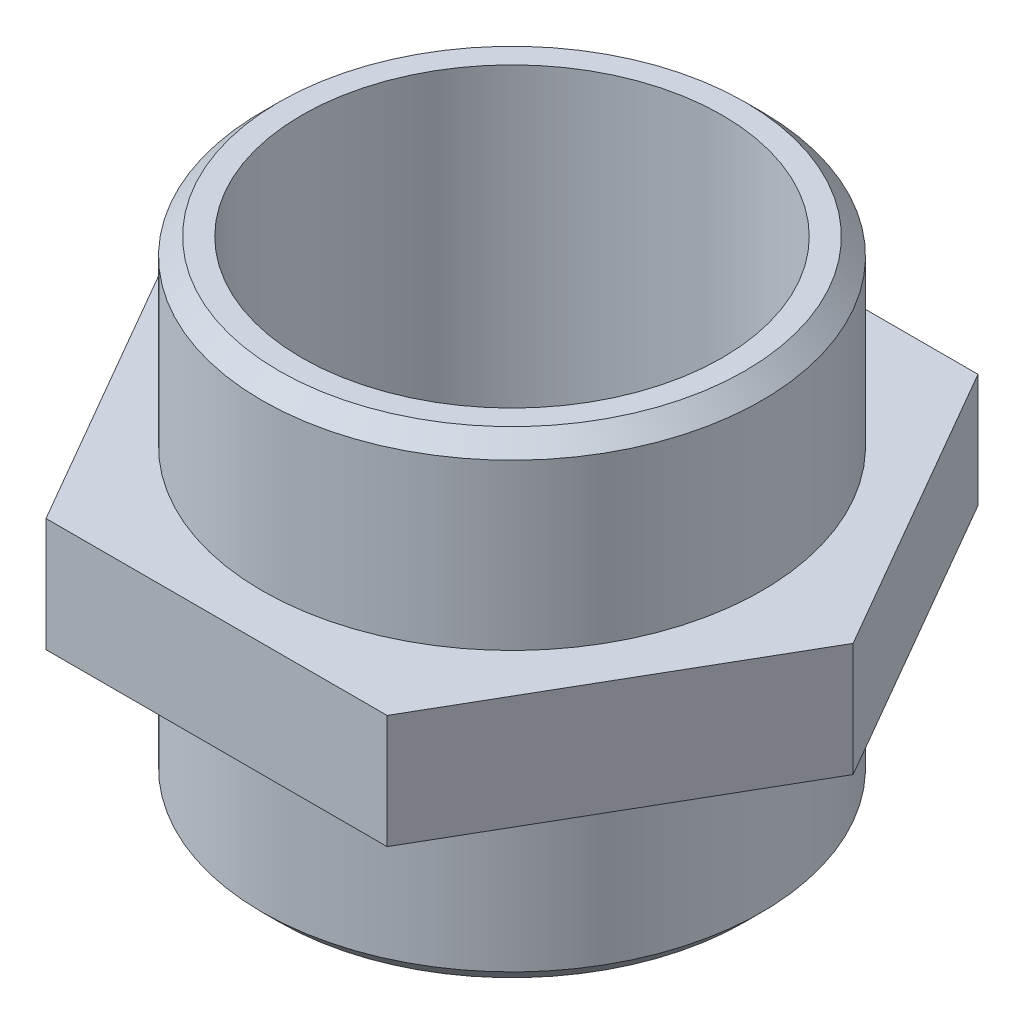
ISO-10303-21;
HEADER;
FILE_DESCRIPTION(('STEP AP214'),'2;1');
FILE_NAME('part.step','',(''),(''),'','','');
FILE_SCHEMA(('AUTOMOTIVE_DESIGN { 1 0 10303 214 1 1 1 1 }'));
ENDSEC;
DATA;
#1=APPLICATION_CONTEXT('core data for automotive mechanical design processes');
#2=APPLICATION_PROTOCOL_DEFINITION('international standard','automotive_design',2000,#1);
#3=PRODUCT_CONTEXT('',#1,'mechanical');
#4=PRODUCT('Part','Part','',(#3));
#5=PRODUCT_RELATED_PRODUCT_CATEGORY('part','',(#4));
#6=PRODUCT_DEFINITION_FORMATION('','',#4);
#7=PRODUCT_DEFINITION_CONTEXT('part definition',#1,'design');
#8=PRODUCT_DEFINITION('design','',#6,#7);
#9=PRODUCT_DEFINITION_SHAPE('','',#8);
#10=(LENGTH_UNIT() NAMED_UNIT(*) SI_UNIT(.MILLI.,.METRE.));
#11=(NAMED_UNIT(*) PLANE_ANGLE_UNIT() SI_UNIT($,.RADIAN.));
#12=(NAMED_UNIT(*) SI_UNIT($,.STERADIAN.) SOLID_ANGLE_UNIT());
#13=UNCERTAINTY_MEASURE_WITH_UNIT(LENGTH_MEASURE(1.E-05),#10,'distance_accuracy_value','');
#14=(GEOMETRIC_REPRESENTATION_CONTEXT(3) GLOBAL_UNCERTAINTY_ASSIGNED_CONTEXT((#13)) GLOBAL_UNIT_ASSIGNED_CONTEXT((#10,
#11,#12)) REPRESENTATION_CONTEXT('',''));
#15=CARTESIAN_POINT('',(0.,0.,0.));
#16=DIRECTION('',(0.,0.,1.));
#17=DIRECTION('',(1.,0.,0.));
#18=AXIS2_PLACEMENT_3D('',#15,#16,#17);
#19=CARTESIAN_POINT('',(0.,5.,0.));
#20=DIRECTION('',(0.,1.,0.));
#21=DIRECTION('',(0.,0.,1.));
#22=AXIS2_PLACEMENT_3D('',#19,#20,#21);
#23=PLANE('',#22);
#24=DIRECTION('',(1.,0.,0.));
#25=VECTOR('',#24,1.);
#26=CARTESIAN_POINT('',(-15.0111069989303,5.,26.));
#27=LINE('',#26,#25);
#28=CARTESIAN_POINT('',(-15.0111069989303,5.,26.));
#29=VERTEX_POINT('',#28);
#30=CARTESIAN_POINT('',(15.0111069989303,5.,26.));
#31=VERTEX_POINT('',#30);
#32=EDGE_CURVE('E129',#29,#31,#27,.T.);
#33=ORIENTED_EDGE('',*,*,#32,.T.);
#34=DIRECTION('',(0.5,0.,-0.866025403784439));
#35=VECTOR('',#34,1.);
#36=CARTESIAN_POINT('',(15.0111069989303,5.,26.));
#37=LINE('',#36,#35);
#38=CARTESIAN_POINT('',(30.0222139978605,5.,0.));
#39=VERTEX_POINT('',#38);
#40=EDGE_CURVE('E87',#31,#39,#37,.T.);
#41=ORIENTED_EDGE('',*,*,#40,.T.);
#42=DIRECTION('',(-0.5,0.,-0.866025403784439));
#43=VECTOR('',#42,1.);
#44=CARTESIAN_POINT('',(30.0222139978605,5.,0.));
#45=LINE('',#44,#43);
#46=CARTESIAN_POINT('',(15.0111069989303,5.,-26.));
#47=VERTEX_POINT('',#46);
#48=EDGE_CURVE('E100',#39,#47,#45,.T.);
#49=ORIENTED_EDGE('',*,*,#48,.T.);
#50=DIRECTION('',(-1.,0.,0.));
#51=VECTOR('',#50,1.);
#52=CARTESIAN_POINT('',(15.0111069989303,5.,-26.));
#53=LINE('',#52,#51);
#54=CARTESIAN_POINT('',(-15.0111069989303,5.,-26.));
#55=VERTEX_POINT('',#54);
#56=EDGE_CURVE('E94',#47,#55,#53,.T.);
#57=ORIENTED_EDGE('',*,*,#56,.T.);
#58=DIRECTION('',(-0.5,0.,0.866025403784439));
#59=VECTOR('',#58,1.);
#60=CARTESIAN_POINT('',(-15.0111069989303,5.,-26.));
#61=LINE('',#60,#59);
#62=CARTESIAN_POINT('',(-30.0222139978605,5.,0.));
#63=VERTEX_POINT('',#62);
#64=EDGE_CURVE('E98',#55,#63,#61,.T.);
#65=ORIENTED_EDGE('',*,*,#64,.T.);
#66=DIRECTION('',(0.5,0.,0.866025403784439));
#67=VECTOR('',#66,1.);
#68=CARTESIAN_POINT('',(-30.0222139978605,5.,0.));
#69=LINE('',#68,#67);
#70=EDGE_CURVE('E49',#63,#29,#69,.T.);
#71=ORIENTED_EDGE('',*,*,#70,.T.);
#72=EDGE_LOOP('',(#33,#41,#49,#57,#65,#71));
#73=FACE_BOUND('',#72,.T.);
#74=CARTESIAN_POINT('',(0.,5.,0.));
#75=DIRECTION('',(0.,1.,0.));
#76=DIRECTION('',(0.,0.,1.));
#77=AXIS2_PLACEMENT_3D('',#74,#75,#76);
#78=CIRCLE('',#77,22.);
#79=CARTESIAN_POINT('',(0.,5.,-22.));
#80=VERTEX_POINT('',#79);
#81=EDGE_CURVE('E122',#80,#80,#78,.F.);
#82=ORIENTED_EDGE('',*,*,#81,.T.);
#83=EDGE_LOOP('',(#82));
#84=FACE_BOUND('',#83,.T.);
#85=ADVANCED_FACE('F32',(#73,#84),#23,.T.);
#86=CARTESIAN_POINT('',(0.,-5.,0.));
#87=DIRECTION('',(0.,1.,0.));
#88=DIRECTION('',(0.,0.,1.));
#89=AXIS2_PLACEMENT_3D('',#86,#87,#88);
#90=PLANE('',#89);
#91=DIRECTION('',(1.,0.,0.));
#92=VECTOR('',#91,1.);
#93=CARTESIAN_POINT('',(-15.0111069989303,-5.,26.));
#94=LINE('',#93,#92);
#95=CARTESIAN_POINT('',(-15.0111069989303,-5.,26.));
#96=VERTEX_POINT('',#95);
#97=CARTESIAN_POINT('',(15.0111069989303,-5.,26.));
#98=VERTEX_POINT('',#97);
#99=EDGE_CURVE('E118',#96,#98,#94,.T.);
#100=ORIENTED_EDGE('',*,*,#99,.F.);
#101=DIRECTION('',(0.5,0.,0.866025403784439));
#102=VECTOR('',#101,1.);
#103=CARTESIAN_POINT('',(-30.0222139978605,-5.,0.));
#104=LINE('',#103,#102);
#105=CARTESIAN_POINT('',(-30.0222139978605,-5.,0.));
#106=VERTEX_POINT('',#105);
#107=EDGE_CURVE('E78',#106,#96,#104,.T.);
#108=ORIENTED_EDGE('',*,*,#107,.F.);
#109=DIRECTION('',(-0.5,0.,0.866025403784439));
#110=VECTOR('',#109,1.);
#111=CARTESIAN_POINT('',(-15.0111069989303,-5.,-26.));
#112=LINE('',#111,#110);
#113=CARTESIAN_POINT('',(-15.0111069989303,-5.,-26.));
#114=VERTEX_POINT('',#113);
#115=EDGE_CURVE('E72',#114,#106,#112,.T.);
#116=ORIENTED_EDGE('',*,*,#115,.F.);
#117=DIRECTION('',(-1.,0.,0.));
#118=VECTOR('',#117,1.);
#119=CARTESIAN_POINT('',(15.0111069989303,-5.,-26.));
#120=LINE('',#119,#118);
#121=CARTESIAN_POINT('',(15.0111069989303,-5.,-26.));
#122=VERTEX_POINT('',#121);
#123=EDGE_CURVE('E108',#122,#114,#120,.T.);
#124=ORIENTED_EDGE('',*,*,#123,.F.);
#125=DIRECTION('',(-0.5,0.,-0.866025403784439));
#126=VECTOR('',#125,1.);
#127=CARTESIAN_POINT('',(30.0222139978605,-5.,0.));
#128=LINE('',#127,#126);
#129=CARTESIAN_POINT('',(30.0222139978605,-5.,0.));
#130=VERTEX_POINT('',#129);
#131=EDGE_CURVE('E124',#130,#122,#128,.T.);
#132=ORIENTED_EDGE('',*,*,#131,.F.);
#133=DIRECTION('',(0.5,0.,-0.866025403784439));
#134=VECTOR('',#133,1.);
#135=CARTESIAN_POINT('',(15.0111069989303,-5.,26.));
#136=LINE('',#135,#134);
#137=EDGE_CURVE('E121',#98,#130,#136,.T.);
#138=ORIENTED_EDGE('',*,*,#137,.F.);
#139=EDGE_LOOP('',(#100,#108,#116,#124,#132,#138));
#140=FACE_BOUND('',#139,.T.);
#141=CARTESIAN_POINT('',(0.,-5.,0.));
#142=DIRECTION('',(0.,1.,0.));
#143=DIRECTION('',(0.,0.,1.));
#144=AXIS2_PLACEMENT_3D('',#141,#142,#143);
#145=CIRCLE('',#144,22.);
#146=CARTESIAN_POINT('',(0.,-5.,-22.));
#147=VERTEX_POINT('',#146);
#148=EDGE_CURVE('E138',#147,#147,#145,.F.);
#149=ORIENTED_EDGE('',*,*,#148,.F.);
#150=EDGE_LOOP('',(#149));
#151=FACE_BOUND('',#150,.T.);
#152=ADVANCED_FACE('F162',(#140,#151),#90,.F.);
#153=CARTESIAN_POINT('',(-15.0111069989303,5.,26.));
#154=DIRECTION('',(0.,0.,-1.));
#155=DIRECTION('',(-1.,0.,0.));
#156=AXIS2_PLACEMENT_3D('',#153,#154,#155);
#157=PLANE('',#156);
#158=ORIENTED_EDGE('',*,*,#99,.T.);
#159=DIRECTION('',(0.,-1.,0.));
#160=VECTOR('',#159,1.);
#161=CARTESIAN_POINT('',(15.0111069989303,5.,26.));
#162=LINE('',#161,#160);
#163=EDGE_CURVE('E136',#31,#98,#162,.T.);
#164=ORIENTED_EDGE('',*,*,#163,.F.);
#165=ORIENTED_EDGE('',*,*,#32,.F.);
#166=DIRECTION('',(0.,-1.,0.));
#167=VECTOR('',#166,1.);
#168=CARTESIAN_POINT('',(-15.0111069989303,5.,26.));
#169=LINE('',#168,#167);
#170=EDGE_CURVE('E114',#29,#96,#169,.T.);
#171=ORIENTED_EDGE('',*,*,#170,.T.);
#172=EDGE_LOOP('',(#158,#164,#165,#171));
#173=FACE_BOUND('',#172,.T.);
#174=ADVANCED_FACE('F167',(#173),#157,.F.);
#175=CARTESIAN_POINT('',(15.0111069989303,5.,26.));
#176=DIRECTION('',(-0.866025403784439,0.,-0.5));
#177=DIRECTION('',(-0.5,0.,0.866025403784439));
#178=AXIS2_PLACEMENT_3D('',#175,#176,#177);
#179=PLANE('',#178);
#180=ORIENTED_EDGE('',*,*,#137,.T.);
#181=DIRECTION('',(0.,-1.,0.));
#182=VECTOR('',#181,1.);
#183=CARTESIAN_POINT('',(30.0222139978605,5.,0.));
#184=LINE('',#183,#182);
#185=EDGE_CURVE('E133',#39,#130,#184,.T.);
#186=ORIENTED_EDGE('',*,*,#185,.F.);
#187=ORIENTED_EDGE('',*,*,#40,.F.);
#188=ORIENTED_EDGE('',*,*,#163,.T.);
#189=EDGE_LOOP('',(#180,#186,#187,#188));
#190=FACE_BOUND('',#189,.T.);
#191=ADVANCED_FACE('F185',(#190),#179,.F.);
#192=CARTESIAN_POINT('',(30.0222139978605,5.,0.));
#193=DIRECTION('',(-0.866025403784439,0.,0.5));
#194=DIRECTION('',(0.5,0.,0.866025403784439));
#195=AXIS2_PLACEMENT_3D('',#192,#193,#194);
#196=PLANE('',#195);
#197=ORIENTED_EDGE('',*,*,#131,.T.);
#198=DIRECTION('',(0.,-1.,0.));
#199=VECTOR('',#198,1.);
#200=CARTESIAN_POINT('',(15.0111069989303,5.,-26.));
#201=LINE('',#200,#199);
#202=EDGE_CURVE('E109',#47,#122,#201,.T.);
#203=ORIENTED_EDGE('',*,*,#202,.F.);
#204=ORIENTED_EDGE('',*,*,#48,.F.);
#205=ORIENTED_EDGE('',*,*,#185,.T.);
#206=EDGE_LOOP('',(#197,#203,#204,#205));
#207=FACE_BOUND('',#206,.T.);
#208=ADVANCED_FACE('F182',(#207),#196,.F.);
#209=CARTESIAN_POINT('',(15.0111069989303,5.,-26.));
#210=DIRECTION('',(0.,0.,1.));
#211=DIRECTION('',(1.,0.,0.));
#212=AXIS2_PLACEMENT_3D('',#209,#210,#211);
#213=PLANE('',#212);
#214=ORIENTED_EDGE('',*,*,#123,.T.);
#215=DIRECTION('',(0.,-1.,0.));
#216=VECTOR('',#215,1.);
#217=CARTESIAN_POINT('',(-15.0111069989303,5.,-26.));
#218=LINE('',#217,#216);
#219=EDGE_CURVE('E105',#55,#114,#218,.T.);
#220=ORIENTED_EDGE('',*,*,#219,.F.);
#221=ORIENTED_EDGE('',*,*,#56,.F.);
#222=ORIENTED_EDGE('',*,*,#202,.T.);
#223=EDGE_LOOP('',(#214,#220,#221,#222));
#224=FACE_BOUND('',#223,.T.);
#225=ADVANCED_FACE('F106',(#224),#213,.F.);
#226=CARTESIAN_POINT('',(-15.0111069989303,5.,-26.));
#227=DIRECTION('',(0.866025403784439,0.,0.5));
#228=DIRECTION('',(0.5,0.,-0.866025403784439));
#229=AXIS2_PLACEMENT_3D('',#226,#227,#228);
#230=PLANE('',#229);
#231=ORIENTED_EDGE('',*,*,#115,.T.);
#232=DIRECTION('',(0.,-1.,0.));
#233=VECTOR('',#232,1.);
#234=CARTESIAN_POINT('',(-30.0222139978605,5.,0.));
#235=LINE('',#234,#233);
#236=EDGE_CURVE('E110',#63,#106,#235,.T.);
#237=ORIENTED_EDGE('',*,*,#236,.F.);
#238=ORIENTED_EDGE('',*,*,#64,.F.);
#239=ORIENTED_EDGE('',*,*,#219,.T.);
#240=EDGE_LOOP('',(#231,#237,#238,#239));
#241=FACE_BOUND('',#240,.T.);
#242=ADVANCED_FACE('F112',(#241),#230,.F.);
#243=CARTESIAN_POINT('',(-30.0222139978605,5.,0.));
#244=DIRECTION('',(0.866025403784439,0.,-0.5));
#245=DIRECTION('',(-0.5,0.,-0.866025403784439));
#246=AXIS2_PLACEMENT_3D('',#243,#244,#245);
#247=PLANE('',#246);
#248=ORIENTED_EDGE('',*,*,#107,.T.);
#249=ORIENTED_EDGE('',*,*,#170,.F.);
#250=ORIENTED_EDGE('',*,*,#70,.F.);
#251=ORIENTED_EDGE('',*,*,#236,.T.);
#252=EDGE_LOOP('',(#248,#249,#250,#251));
#253=FACE_BOUND('',#252,.T.);
#254=ADVANCED_FACE('F174',(#253),#247,.F.);
#255=CARTESIAN_POINT('',(0.,21.,0.));
#256=DIRECTION('',(0.,-1.,0.));
#257=DIRECTION('',(0.,0.,-1.));
#258=AXIS2_PLACEMENT_3D('',#255,#256,#257);
#259=CYLINDRICAL_SURFACE('',#258,22.);
#260=CARTESIAN_POINT('',(0.,-19.5,0.));
#261=DIRECTION('',(0.,1.,0.));
#262=DIRECTION('',(0.,0.,1.));
#263=AXIS2_PLACEMENT_3D('',#260,#261,#262);
#264=CIRCLE('',#263,22.);
#265=CARTESIAN_POINT('',(0.,-19.5,-22.));
#266=VERTEX_POINT('',#265);
#267=EDGE_CURVE('E141',#266,#266,#264,.T.);
#268=CARTESIAN_POINT('',(0.,-19.5,-22.));
#269=CARTESIAN_POINT('',(0.,-19.3489583333333,-22.));
#270=CARTESIAN_POINT('',(0.,-19.1979166666666,-22.));
#271=CARTESIAN_POINT('',(0.,-18.8958333333333,-22.));
#272=CARTESIAN_POINT('',(0.,-18.7447916666666,-22.));
#273=CARTESIAN_POINT('',(0.,-18.4427083333333,-22.));
#274=CARTESIAN_POINT('',(0.,-18.2916666666666,-22.));
#275=CARTESIAN_POINT('',(0.,-17.9895833333333,-22.));
#276=CARTESIAN_POINT('',(0.,-17.8385416666666,-22.));
#277=CARTESIAN_POINT('',(0.,-17.5364583333333,-22.));
#278=CARTESIAN_POINT('',(0.,-17.3854166666666,-22.));
#279=CARTESIAN_POINT('',(0.,-17.0833333333333,-22.));
#280=CARTESIAN_POINT('',(0.,-16.9322916666666,-22.));
#281=CARTESIAN_POINT('',(0.,-16.6302083333333,-22.));
#282=CARTESIAN_POINT('',(0.,-16.4791666666666,-22.));
#283=CARTESIAN_POINT('',(0.,-16.1770833333333,-22.));
#284=CARTESIAN_POINT('',(0.,-16.0260416666666,-22.));
#285=CARTESIAN_POINT('',(0.,-15.7239583333333,-22.));
#286=CARTESIAN_POINT('',(0.,-15.5729166666666,-22.));
#287=CARTESIAN_POINT('',(0.,-15.2708333333333,-22.));
#288=CARTESIAN_POINT('',(0.,-15.1197916666666,-22.));
#289=CARTESIAN_POINT('',(0.,-14.8177083333333,-22.));
#290=CARTESIAN_POINT('',(0.,-14.6666666666666,-22.));
#291=CARTESIAN_POINT('',(0.,-14.3645833333333,-22.));
#292=CARTESIAN_POINT('',(0.,-14.2135416666666,-22.));
#293=CARTESIAN_POINT('',(0.,-13.9114583333333,-22.));
#294=CARTESIAN_POINT('',(0.,-13.7604166666666,-22.));
#295=CARTESIAN_POINT('',(0.,-13.4583333333333,-22.));
#296=CARTESIAN_POINT('',(0.,-13.3072916666666,-22.));
#297=CARTESIAN_POINT('',(0.,-13.0052083333333,-22.));
#298=CARTESIAN_POINT('',(0.,-12.8541666666666,-22.));
#299=CARTESIAN_POINT('',(0.,-12.5520833333333,-22.));
#300=CARTESIAN_POINT('',(0.,-12.4010416666666,-22.));
#301=CARTESIAN_POINT('',(0.,-12.0989583333333,-22.));
#302=CARTESIAN_POINT('',(0.,-11.9479166666666,-22.));
#303=CARTESIAN_POINT('',(0.,-11.6458333333333,-22.));
#304=CARTESIAN_POINT('',(0.,-11.4947916666666,-22.));
#305=CARTESIAN_POINT('',(0.,-11.1927083333333,-22.));
#306=CARTESIAN_POINT('',(0.,-11.0416666666667,-22.));
#307=CARTESIAN_POINT('',(0.,-10.7395833333333,-22.));
#308=CARTESIAN_POINT('',(0.,-10.5885416666667,-22.));
#309=CARTESIAN_POINT('',(0.,-10.2864583333333,-22.));
#310=CARTESIAN_POINT('',(0.,-10.1354166666667,-22.));
#311=CARTESIAN_POINT('',(0.,-9.83333333333332,-22.));
#312=CARTESIAN_POINT('',(0.,-9.68229166666666,-22.));
#313=CARTESIAN_POINT('',(0.,-9.38020833333333,-22.));
#314=CARTESIAN_POINT('',(0.,-9.22916666666666,-22.));
#315=CARTESIAN_POINT('',(0.,-8.92708333333333,-22.));
#316=CARTESIAN_POINT('',(0.,-8.77604166666666,-22.));
#317=CARTESIAN_POINT('',(0.,-8.47395833333333,-22.));
#318=CARTESIAN_POINT('',(0.,-8.32291666666666,-22.));
#319=CARTESIAN_POINT('',(0.,-8.02083333333333,-22.));
#320=CARTESIAN_POINT('',(0.,-7.86979166666666,-22.));
#321=CARTESIAN_POINT('',(0.,-7.56770833333333,-22.));
#322=CARTESIAN_POINT('',(0.,-7.41666666666666,-22.));
#323=CARTESIAN_POINT('',(0.,-7.11458333333333,-22.));
#324=CARTESIAN_POINT('',(0.,-6.96354166666667,-22.));
#325=CARTESIAN_POINT('',(0.,-6.66145833333333,-22.));
#326=CARTESIAN_POINT('',(0.,-6.51041666666667,-22.));
#327=CARTESIAN_POINT('',(0.,-6.20833333333333,-22.));
#328=CARTESIAN_POINT('',(0.,-6.05729166666667,-22.));
#329=CARTESIAN_POINT('',(0.,-5.75520833333334,-22.));
#330=CARTESIAN_POINT('',(0.,-5.60416666666667,-22.));
#331=CARTESIAN_POINT('',(0.,-5.30208333333334,-22.));
#332=CARTESIAN_POINT('',(0.,-5.15104166666667,-22.));
#333=CARTESIAN_POINT('',(0.,-5.,-22.));
#334=B_SPLINE_CURVE_WITH_KNOTS('',3,(#268,#269,#270,#271,#272,#273,#274,#275,#276,#277,#278,
#279,#280,#281,#282,#283,#284,#285,#286,#287,#288,#289,#290,#291,#292,#293,#294,#295,#296,#297,
#298,#299,#300,#301,#302,#303,#304,#305,#306,#307,#308,#309,#310,#311,#312,#313,#314,#315,#316,
#317,#318,#319,#320,#321,#322,#323,#324,#325,#326,#327,#328,#329,#330,#331,#332,#333),
.UNSPECIFIED.,.F.,.F.,(4,2,2,2,2,2,2,2,2,2,2,2,2,2,2,2,2,2,2,2,2,2,2,2,2,2,2,2,2,2,2,2,4),(0.,
0.453124999999999,0.906249999999997,1.359375,1.81249999999999,2.26562499999999,2.71874999999999,
3.17187499999999,3.62499999999999,4.07812499999999,4.53124999999999,4.98437499999999,
5.43749999999998,5.89062499999998,6.34374999999998,6.79687499999998,7.24999999999998,
7.70312499999998,8.15624999999998,8.60937499999998,9.06249999999997,9.51562499999997,
9.96874999999997,10.421875,10.875,11.328125,11.78125,12.234375,12.6875,13.140625,13.59375,
14.046875,14.5),.UNSPECIFIED.);
#335=EDGE_CURVE('BSEAM177',#266,#147,#334,.T.);
#336=ORIENTED_EDGE('',*,*,#267,.T.);
#337=ORIENTED_EDGE('',*,*,#148,.T.);
#338=ORIENTED_EDGE('',*,*,#335,.T.);
#339=ORIENTED_EDGE('',*,*,#335,.F.);
#340=EDGE_LOOP('',(#336,#338,#337,#339));
#341=FACE_BOUND('',#340,.T.);
#342=ADVANCED_FACE('F177',(#341),#259,.T.);
#343=CARTESIAN_POINT('',(0.,-21.,0.));
#344=DIRECTION('',(0.,1.,0.));
#345=DIRECTION('',(0.,0.,1.));
#346=AXIS2_PLACEMENT_3D('',#343,#344,#345);
#347=PLANE('',#346);
#348=CARTESIAN_POINT('',(0.,-21.,0.));
#349=DIRECTION('',(0.,1.,0.));
#350=DIRECTION('',(0.,0.,1.));
#351=AXIS2_PLACEMENT_3D('',#348,#349,#350);
#352=CIRCLE('',#351,20.5);
#353=CARTESIAN_POINT('',(0.,-21.,20.5));
#354=VERTEX_POINT('',#353);
#355=EDGE_CURVE('E144',#354,#354,#352,.F.);
#356=ORIENTED_EDGE('',*,*,#355,.T.);
#357=EDGE_LOOP('',(#356));
#358=FACE_BOUND('',#357,.T.);
#359=CARTESIAN_POINT('',(0.,-21.,0.));
#360=DIRECTION('',(0.,1.,0.));
#361=DIRECTION('',(0.,0.,1.));
#362=AXIS2_PLACEMENT_3D('',#359,#360,#361);
#363=CIRCLE('',#362,18.5);
#364=CARTESIAN_POINT('',(0.,-21.,18.5));
#365=VERTEX_POINT('',#364);
#366=EDGE_CURVE('E204',#365,#365,#363,.T.);
#367=ORIENTED_EDGE('',*,*,#366,.T.);
#368=EDGE_LOOP('',(#367));
#369=FACE_BOUND('',#368,.T.);
#370=ADVANCED_FACE('F217',(#358,#369),#347,.F.);
#371=CARTESIAN_POINT('',(0.,5.,0.));
#372=DIRECTION('',(0.,-1.,0.));
#373=DIRECTION('',(0.,0.,-1.));
#374=AXIS2_PLACEMENT_3D('',#371,#372,#373);
#375=CYLINDRICAL_SURFACE('',#374,18.5);
#376=ORIENTED_EDGE('',*,*,#366,.F.);
#377=EDGE_LOOP('',(#376));
#378=FACE_BOUND('',#377,.T.);
#379=CARTESIAN_POINT('',(0.,21.,0.));
#380=DIRECTION('',(0.,1.,0.));
#381=DIRECTION('',(0.,0.,1.));
#382=AXIS2_PLACEMENT_3D('',#379,#380,#381);
#383=CIRCLE('',#382,18.5);
#384=CARTESIAN_POINT('',(0.,21.,18.5));
#385=VERTEX_POINT('',#384);
#386=EDGE_CURVE('E203',#385,#385,#383,.T.);
#387=ORIENTED_EDGE('',*,*,#386,.T.);
#388=EDGE_LOOP('',(#387));
#389=FACE_BOUND('',#388,.T.);
#390=ADVANCED_FACE('F171',(#378,#389),#375,.F.);
#391=CARTESIAN_POINT('',(0.,21.,0.));
#392=DIRECTION('',(0.,1.,0.));
#393=DIRECTION('',(0.,0.,1.));
#394=AXIS2_PLACEMENT_3D('',#391,#392,#393);
#395=PLANE('',#394);
#396=CARTESIAN_POINT('',(0.,21.,0.));
#397=DIRECTION('',(0.,1.,0.));
#398=DIRECTION('',(0.,0.,1.));
#399=AXIS2_PLACEMENT_3D('',#396,#397,#398);
#400=CIRCLE('',#399,20.5);
#401=CARTESIAN_POINT('',(0.,21.,20.5));
#402=VERTEX_POINT('',#401);
#403=EDGE_CURVE('E41',#402,#402,#400,.T.);
#404=ORIENTED_EDGE('',*,*,#403,.T.);
#405=EDGE_LOOP('',(#404));
#406=FACE_BOUND('',#405,.T.);
#407=ORIENTED_EDGE('',*,*,#386,.F.);
#408=EDGE_LOOP('',(#407));
#409=FACE_BOUND('',#408,.T.);
#410=ADVANCED_FACE('F149',(#406,#409),#395,.T.);
#411=CARTESIAN_POINT('',(0.,19.5,0.));
#412=DIRECTION('',(0.,1.,0.));
#413=DIRECTION('',(0.,0.,1.));
#414=AXIS2_PLACEMENT_3D('',#411,#412,#413);
#415=CIRCLE('',#414,22.);
#416=CARTESIAN_POINT('',(0.,19.5,-22.));
#417=VERTEX_POINT('',#416);
#418=EDGE_CURVE('E11',#417,#417,#415,.F.);
#419=CARTESIAN_POINT('',(0.,19.5,-22.));
#420=CARTESIAN_POINT('',(0.,19.3489583333334,-22.));
#421=CARTESIAN_POINT('',(0.,19.1979166666667,-22.));
#422=CARTESIAN_POINT('',(0.,18.8958333333334,-22.));
#423=CARTESIAN_POINT('',(0.,18.7447916666667,-22.));
#424=CARTESIAN_POINT('',(0.,18.4427083333334,-22.));
#425=CARTESIAN_POINT('',(0.,18.2916666666667,-22.));
#426=CARTESIAN_POINT('',(0.,17.9895833333334,-22.));
#427=CARTESIAN_POINT('',(0.,17.8385416666667,-22.));
#428=CARTESIAN_POINT('',(0.,17.5364583333334,-22.));
#429=CARTESIAN_POINT('',(0.,17.3854166666667,-22.));
#430=CARTESIAN_POINT('',(0.,17.0833333333334,-22.));
#431=CARTESIAN_POINT('',(0.,16.9322916666667,-22.));
#432=CARTESIAN_POINT('',(0.,16.6302083333334,-22.));
#433=CARTESIAN_POINT('',(0.,16.4791666666667,-22.));
#434=CARTESIAN_POINT('',(0.,16.1770833333334,-22.));
#435=CARTESIAN_POINT('',(0.,16.0260416666667,-22.));
#436=CARTESIAN_POINT('',(0.,15.7239583333334,-22.));
#437=CARTESIAN_POINT('',(0.,15.5729166666667,-22.));
#438=CARTESIAN_POINT('',(0.,15.2708333333334,-22.));
#439=CARTESIAN_POINT('',(0.,15.1197916666667,-22.));
#440=CARTESIAN_POINT('',(0.,14.8177083333334,-22.));
#441=CARTESIAN_POINT('',(0.,14.6666666666667,-22.));
#442=CARTESIAN_POINT('',(0.,14.3645833333333,-22.));
#443=CARTESIAN_POINT('',(0.,14.2135416666667,-22.));
#444=CARTESIAN_POINT('',(0.,13.9114583333333,-22.));
#445=CARTESIAN_POINT('',(0.,13.7604166666667,-22.));
#446=CARTESIAN_POINT('',(0.,13.4583333333333,-22.));
#447=CARTESIAN_POINT('',(0.,13.3072916666667,-22.));
#448=CARTESIAN_POINT('',(0.,13.0052083333333,-22.));
#449=CARTESIAN_POINT('',(0.,12.8541666666667,-22.));
#450=CARTESIAN_POINT('',(0.,12.5520833333333,-22.));
#451=CARTESIAN_POINT('',(0.,12.4010416666667,-22.));
#452=CARTESIAN_POINT('',(0.,12.0989583333333,-22.));
#453=CARTESIAN_POINT('',(0.,11.9479166666667,-22.));
#454=CARTESIAN_POINT('',(0.,11.6458333333333,-22.));
#455=CARTESIAN_POINT('',(0.,11.4947916666667,-22.));
#456=CARTESIAN_POINT('',(0.,11.1927083333333,-22.));
#457=CARTESIAN_POINT('',(0.,11.0416666666667,-22.));
#458=CARTESIAN_POINT('',(0.,10.7395833333333,-22.));
#459=CARTESIAN_POINT('',(0.,10.5885416666667,-22.));
#460=CARTESIAN_POINT('',(0.,10.2864583333333,-22.));
#461=CARTESIAN_POINT('',(0.,10.1354166666667,-22.));
#462=CARTESIAN_POINT('',(0.,9.83333333333334,-22.));
#463=CARTESIAN_POINT('',(0.,9.68229166666667,-22.));
#464=CARTESIAN_POINT('',(0.,9.38020833333334,-22.));
#465=CARTESIAN_POINT('',(0.,9.22916666666667,-22.));
#466=CARTESIAN_POINT('',(0.,8.92708333333334,-22.));
#467=CARTESIAN_POINT('',(0.,8.77604166666667,-22.));
#468=CARTESIAN_POINT('',(0.,8.47395833333334,-22.));
#469=CARTESIAN_POINT('',(0.,8.32291666666667,-22.));
#470=CARTESIAN_POINT('',(0.,8.02083333333334,-22.));
#471=CARTESIAN_POINT('',(0.,7.86979166666667,-22.));
#472=CARTESIAN_POINT('',(0.,7.56770833333333,-22.));
#473=CARTESIAN_POINT('',(0.,7.41666666666667,-22.));
#474=CARTESIAN_POINT('',(0.,7.11458333333333,-22.));
#475=CARTESIAN_POINT('',(0.,6.96354166666667,-22.));
#476=CARTESIAN_POINT('',(0.,6.66145833333333,-22.));
#477=CARTESIAN_POINT('',(0.,6.51041666666667,-22.));
#478=CARTESIAN_POINT('',(0.,6.20833333333333,-22.));
#479=CARTESIAN_POINT('',(0.,6.05729166666667,-22.));
#480=CARTESIAN_POINT('',(0.,5.75520833333333,-22.));
#481=CARTESIAN_POINT('',(0.,5.60416666666666,-22.));
#482=CARTESIAN_POINT('',(0.,5.30208333333333,-22.));
#483=CARTESIAN_POINT('',(0.,5.15104166666666,-22.));
#484=CARTESIAN_POINT('',(0.,5.,-22.));
#485=B_SPLINE_CURVE_WITH_KNOTS('',3,(#419,#420,#421,#422,#423,#424,#425,#426,#427,#428,#429,
#430,#431,#432,#433,#434,#435,#436,#437,#438,#439,#440,#441,#442,#443,#444,#445,#446,#447,#448,
#449,#450,#451,#452,#453,#454,#455,#456,#457,#458,#459,#460,#461,#462,#463,#464,#465,#466,#467,
#468,#469,#470,#471,#472,#473,#474,#475,#476,#477,#478,#479,#480,#481,#482,#483,#484),
.UNSPECIFIED.,.F.,.F.,(4,2,2,2,2,2,2,2,2,2,2,2,2,2,2,2,2,2,2,2,2,2,2,2,2,2,2,2,2,2,2,2,4),(0.,
0.453124999999999,0.906250000000001,1.359375,1.8125,2.265625,2.71875000000001,3.171875,
3.62500000000001,4.07812500000001,4.53125000000001,4.98437500000001,5.43750000000001,
5.89062500000001,6.34375000000001,6.79687500000001,7.25000000000002,7.70312500000002,
8.15625000000002,8.60937500000002,9.06250000000002,9.51562500000002,9.96875000000002,10.421875,
10.875,11.328125,11.78125,12.234375,12.6875,13.140625,13.59375,14.046875,14.5),.UNSPECIFIED.);
#486=EDGE_CURVE('BSEAM158',#417,#80,#485,.T.);
#487=ORIENTED_EDGE('',*,*,#418,.T.);
#488=ORIENTED_EDGE('',*,*,#81,.F.);
#489=ORIENTED_EDGE('',*,*,#486,.T.);
#490=ORIENTED_EDGE('',*,*,#486,.F.);
#491=EDGE_LOOP('',(#487,#489,#488,#490));
#492=FACE_BOUND('',#491,.T.);
#493=ADVANCED_FACE('F158',(#492),#259,.T.);
#494=CARTESIAN_POINT('',(0.,-19.5,0.));
#495=DIRECTION('',(0.,1.,0.));
#496=DIRECTION('',(0.,0.,1.));
#497=AXIS2_PLACEMENT_3D('',#494,#495,#496);
#498=CONICAL_SURFACE('',#497,22.,0.785398163397452);
#499=ORIENTED_EDGE('',*,*,#355,.F.);
#500=EDGE_LOOP('',(#499));
#501=FACE_BOUND('',#500,.T.);
#502=ORIENTED_EDGE('',*,*,#267,.F.);
#503=EDGE_LOOP('',(#502));
#504=FACE_BOUND('',#503,.T.);
#505=ADVANCED_FACE('F153',(#501,#504),#498,.T.);
#506=CARTESIAN_POINT('',(0.,21.,0.));
#507=DIRECTION('',(0.,-1.,0.));
#508=DIRECTION('',(0.,0.,-1.));
#509=AXIS2_PLACEMENT_3D('',#506,#507,#508);
#510=CONICAL_SURFACE('',#509,20.5,0.785398163397448);
#511=ORIENTED_EDGE('',*,*,#418,.F.);
#512=EDGE_LOOP('',(#511));
#513=FACE_BOUND('',#512,.T.);
#514=ORIENTED_EDGE('',*,*,#403,.F.);
#515=EDGE_LOOP('',(#514));
#516=FACE_BOUND('',#515,.T.);
#517=ADVANCED_FACE('F34',(#513,#516),#510,.T.);
#518=CLOSED_SHELL('',(#85,#152,#174,#191,#208,#225,#242,#254,#342,#370,#390,#410,#493,#505,#517));
#519=MANIFOLD_SOLID_BREP('B2',#518);
#520=ADVANCED_BREP_SHAPE_REPRESENTATION('',(#18,#519),#14);
#521=SHAPE_DEFINITION_REPRESENTATION(#9,#520);
ENDSEC;
END-ISO-10303-21;
